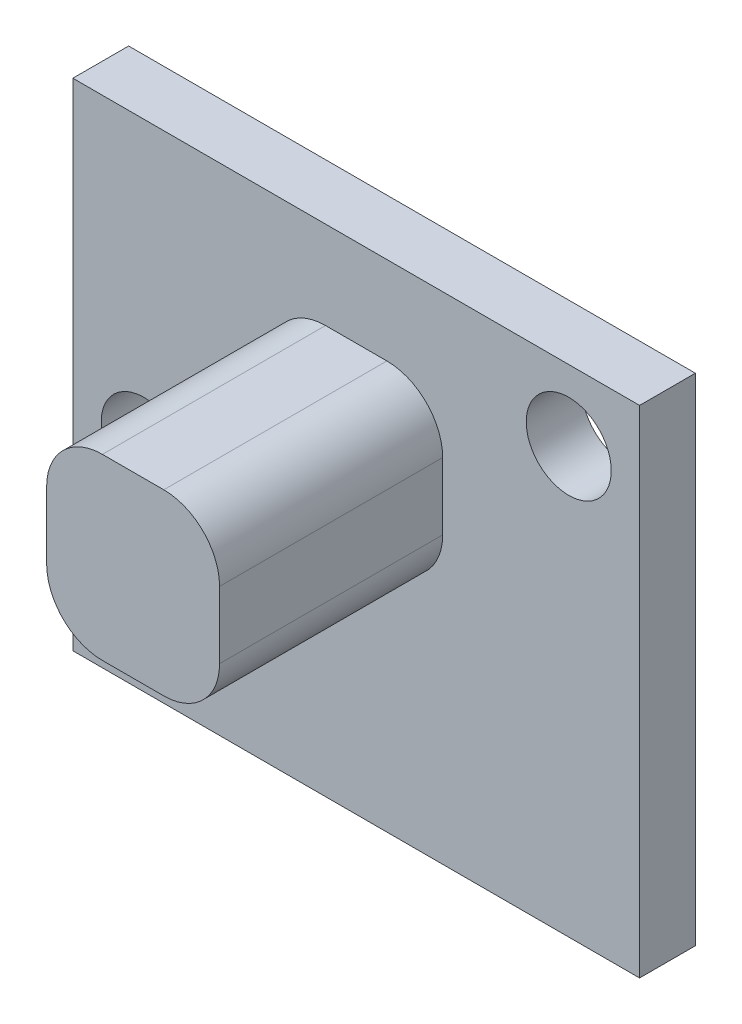
ISO-10303-21;
HEADER;
FILE_DESCRIPTION(('STEP AP214'),'2;1');
FILE_NAME('part.step','',(''),(''),'','','');
FILE_SCHEMA(('AUTOMOTIVE_DESIGN { 1 0 10303 214 1 1 1 1 }'));
ENDSEC;
DATA;
#1=APPLICATION_CONTEXT('core data for automotive mechanical design processes');
#2=APPLICATION_PROTOCOL_DEFINITION('international standard','automotive_design',2000,#1);
#3=PRODUCT_CONTEXT('',#1,'mechanical');
#4=PRODUCT('Part','Part','',(#3));
#5=PRODUCT_RELATED_PRODUCT_CATEGORY('part','',(#4));
#6=PRODUCT_DEFINITION_FORMATION('','',#4);
#7=PRODUCT_DEFINITION_CONTEXT('part definition',#1,'design');
#8=PRODUCT_DEFINITION('design','',#6,#7);
#9=PRODUCT_DEFINITION_SHAPE('','',#8);
#10=(LENGTH_UNIT() NAMED_UNIT(*) SI_UNIT(.MILLI.,.METRE.));
#11=(NAMED_UNIT(*) PLANE_ANGLE_UNIT() SI_UNIT($,.RADIAN.));
#12=(NAMED_UNIT(*) SI_UNIT($,.STERADIAN.) SOLID_ANGLE_UNIT());
#13=UNCERTAINTY_MEASURE_WITH_UNIT(LENGTH_MEASURE(1.E-05),#10,'distance_accuracy_value','');
#14=(GEOMETRIC_REPRESENTATION_CONTEXT(3) GLOBAL_UNCERTAINTY_ASSIGNED_CONTEXT((#13)) GLOBAL_UNIT_ASSIGNED_CONTEXT((#10,
#11,#12)) REPRESENTATION_CONTEXT('',''));
#15=CARTESIAN_POINT('',(0.,0.,0.));
#16=DIRECTION('',(0.,0.,1.));
#17=DIRECTION('',(1.,0.,0.));
#18=AXIS2_PLACEMENT_3D('',#15,#16,#17);
#19=CARTESIAN_POINT('',(0.,0.,2.));
#20=DIRECTION('',(0.,1.,0.));
#21=DIRECTION('',(0.,0.,1.));
#22=AXIS2_PLACEMENT_3D('',#19,#20,#21);
#23=PLANE('',#22);
#24=DIRECTION('',(1.,0.,0.));
#25=VECTOR('',#24,1.);
#26=CARTESIAN_POINT('',(0.,0.,0.));
#27=LINE('',#26,#25);
#28=CARTESIAN_POINT('',(0.,0.,0.));
#29=VERTEX_POINT('',#28);
#30=CARTESIAN_POINT('',(20.32,0.,0.));
#31=VERTEX_POINT('',#30);
#32=EDGE_CURVE('E170',#29,#31,#27,.T.);
#33=ORIENTED_EDGE('',*,*,#32,.T.);
#34=DIRECTION('',(0.,0.,-1.));
#35=VECTOR('',#34,1.);
#36=CARTESIAN_POINT('',(20.32,0.,2.));
#37=LINE('',#36,#35);
#38=CARTESIAN_POINT('',(20.32,0.,2.));
#39=VERTEX_POINT('',#38);
#40=EDGE_CURVE('E151',#39,#31,#37,.T.);
#41=ORIENTED_EDGE('',*,*,#40,.F.);
#42=DIRECTION('',(1.,0.,0.));
#43=VECTOR('',#42,1.);
#44=CARTESIAN_POINT('',(0.,0.,2.));
#45=LINE('',#44,#43);
#46=CARTESIAN_POINT('',(0.,0.,2.));
#47=VERTEX_POINT('',#46);
#48=EDGE_CURVE('E158',#47,#39,#45,.T.);
#49=ORIENTED_EDGE('',*,*,#48,.F.);
#50=DIRECTION('',(0.,0.,-1.));
#51=VECTOR('',#50,1.);
#52=CARTESIAN_POINT('',(0.,0.,2.));
#53=LINE('',#52,#51);
#54=EDGE_CURVE('E253',#47,#29,#53,.T.);
#55=ORIENTED_EDGE('',*,*,#54,.T.);
#56=EDGE_LOOP('',(#33,#41,#49,#55));
#57=FACE_BOUND('',#56,.T.);
#58=ADVANCED_FACE('F59',(#57),#23,.F.);
#59=CARTESIAN_POINT('',(20.32,0.,2.));
#60=DIRECTION('',(-1.,0.,0.));
#61=DIRECTION('',(0.,0.,1.));
#62=AXIS2_PLACEMENT_3D('',#59,#60,#61);
#63=PLANE('',#62);
#64=DIRECTION('',(0.,1.,0.));
#65=VECTOR('',#64,1.);
#66=CARTESIAN_POINT('',(20.32,0.,0.));
#67=LINE('',#66,#65);
#68=CARTESIAN_POINT('',(20.32,17.78,0.));
#69=VERTEX_POINT('',#68);
#70=EDGE_CURVE('E260',#31,#69,#67,.T.);
#71=ORIENTED_EDGE('',*,*,#70,.T.);
#72=DIRECTION('',(0.,0.,-1.));
#73=VECTOR('',#72,1.);
#74=CARTESIAN_POINT('',(20.32,17.78,2.));
#75=LINE('',#74,#73);
#76=CARTESIAN_POINT('',(20.32,17.78,2.));
#77=VERTEX_POINT('',#76);
#78=EDGE_CURVE('E154',#77,#69,#75,.T.);
#79=ORIENTED_EDGE('',*,*,#78,.F.);
#80=DIRECTION('',(0.,1.,0.));
#81=VECTOR('',#80,1.);
#82=CARTESIAN_POINT('',(20.32,0.,2.));
#83=LINE('',#82,#81);
#84=EDGE_CURVE('E147',#39,#77,#83,.T.);
#85=ORIENTED_EDGE('',*,*,#84,.F.);
#86=ORIENTED_EDGE('',*,*,#40,.T.);
#87=EDGE_LOOP('',(#71,#79,#85,#86));
#88=FACE_BOUND('',#87,.T.);
#89=ADVANCED_FACE('F149',(#88),#63,.F.);
#90=CARTESIAN_POINT('',(0.,17.78,2.));
#91=DIRECTION('',(0.,-1.,0.));
#92=DIRECTION('',(0.,0.,-1.));
#93=AXIS2_PLACEMENT_3D('',#90,#91,#92);
#94=PLANE('',#93);
#95=DIRECTION('',(-1.,0.,0.));
#96=VECTOR('',#95,1.);
#97=CARTESIAN_POINT('',(0.,17.78,0.));
#98=LINE('',#97,#96);
#99=CARTESIAN_POINT('',(0.,17.78,0.));
#100=VERTEX_POINT('',#99);
#101=EDGE_CURVE('E262',#69,#100,#98,.T.);
#102=ORIENTED_EDGE('',*,*,#101,.T.);
#103=DIRECTION('',(0.,0.,-1.));
#104=VECTOR('',#103,1.);
#105=CARTESIAN_POINT('',(0.,17.78,2.));
#106=LINE('',#105,#104);
#107=CARTESIAN_POINT('',(0.,17.78,2.));
#108=VERTEX_POINT('',#107);
#109=EDGE_CURVE('E175',#108,#100,#106,.T.);
#110=ORIENTED_EDGE('',*,*,#109,.F.);
#111=DIRECTION('',(-1.,0.,0.));
#112=VECTOR('',#111,1.);
#113=CARTESIAN_POINT('',(0.,17.78,2.));
#114=LINE('',#113,#112);
#115=EDGE_CURVE('E157',#77,#108,#114,.T.);
#116=ORIENTED_EDGE('',*,*,#115,.F.);
#117=ORIENTED_EDGE('',*,*,#78,.T.);
#118=EDGE_LOOP('',(#102,#110,#116,#117));
#119=FACE_BOUND('',#118,.T.);
#120=ADVANCED_FACE('F274',(#119),#94,.F.);
#121=CARTESIAN_POINT('',(2.54,7.62,2.));
#122=DIRECTION('',(0.,0.,-1.));
#123=DIRECTION('',(-1.,0.,0.));
#124=AXIS2_PLACEMENT_3D('',#121,#122,#123);
#125=CYLINDRICAL_SURFACE('',#124,1.524);
#126=CARTESIAN_POINT('',(2.54,7.62,2.));
#127=DIRECTION('',(0.,0.,1.));
#128=DIRECTION('',(1.,0.,0.));
#129=AXIS2_PLACEMENT_3D('',#126,#127,#128);
#130=CIRCLE('',#129,1.524);
#131=CARTESIAN_POINT('',(4.064,7.62,2.));
#132=VERTEX_POINT('',#131);
#133=EDGE_CURVE('E167',#132,#132,#130,.T.);
#134=ORIENTED_EDGE('',*,*,#133,.T.);
#135=EDGE_LOOP('',(#134));
#136=FACE_BOUND('',#135,.T.);
#137=CARTESIAN_POINT('',(2.54,7.62,0.));
#138=DIRECTION('',(0.,0.,1.));
#139=DIRECTION('',(1.,0.,0.));
#140=AXIS2_PLACEMENT_3D('',#137,#138,#139);
#141=CIRCLE('',#140,1.524);
#142=CARTESIAN_POINT('',(4.064,7.62,0.));
#143=VERTEX_POINT('',#142);
#144=EDGE_CURVE('E256',#143,#143,#141,.T.);
#145=ORIENTED_EDGE('',*,*,#144,.F.);
#146=EDGE_LOOP('',(#145));
#147=FACE_BOUND('',#146,.T.);
#148=ADVANCED_FACE('F276',(#136,#147),#125,.F.);
#149=CARTESIAN_POINT('',(17.78,15.24,2.));
#150=DIRECTION('',(0.,0.,-1.));
#151=DIRECTION('',(-1.,0.,0.));
#152=AXIS2_PLACEMENT_3D('',#149,#150,#151);
#153=CYLINDRICAL_SURFACE('',#152,1.524);
#154=CARTESIAN_POINT('',(17.78,15.24,2.));
#155=DIRECTION('',(0.,0.,1.));
#156=DIRECTION('',(1.,0.,0.));
#157=AXIS2_PLACEMENT_3D('',#154,#155,#156);
#158=CIRCLE('',#157,1.524);
#159=CARTESIAN_POINT('',(19.304,15.24,2.));
#160=VERTEX_POINT('',#159);
#161=EDGE_CURVE('E245',#160,#160,#158,.T.);
#162=ORIENTED_EDGE('',*,*,#161,.T.);
#163=EDGE_LOOP('',(#162));
#164=FACE_BOUND('',#163,.T.);
#165=CARTESIAN_POINT('',(17.78,15.24,0.));
#166=DIRECTION('',(0.,0.,1.));
#167=DIRECTION('',(1.,0.,0.));
#168=AXIS2_PLACEMENT_3D('',#165,#166,#167);
#169=CIRCLE('',#168,1.524);
#170=CARTESIAN_POINT('',(19.304,15.24,0.));
#171=VERTEX_POINT('',#170);
#172=EDGE_CURVE('E216',#171,#171,#169,.T.);
#173=ORIENTED_EDGE('',*,*,#172,.F.);
#174=EDGE_LOOP('',(#173));
#175=FACE_BOUND('',#174,.T.);
#176=ADVANCED_FACE('F282',(#164,#175),#153,.F.);
#177=CARTESIAN_POINT('',(0.,0.,2.));
#178=DIRECTION('',(1.,0.,0.));
#179=DIRECTION('',(0.,1.,0.));
#180=AXIS2_PLACEMENT_3D('',#177,#178,#179);
#181=PLANE('',#180);
#182=DIRECTION('',(0.,-1.,0.));
#183=VECTOR('',#182,1.);
#184=CARTESIAN_POINT('',(0.,0.,0.));
#185=LINE('',#184,#183);
#186=EDGE_CURVE('E248',#100,#29,#185,.T.);
#187=ORIENTED_EDGE('',*,*,#186,.T.);
#188=ORIENTED_EDGE('',*,*,#54,.F.);
#189=DIRECTION('',(0.,-1.,0.));
#190=VECTOR('',#189,1.);
#191=CARTESIAN_POINT('',(0.,0.,2.));
#192=LINE('',#191,#190);
#193=EDGE_CURVE('E163',#108,#47,#192,.T.);
#194=ORIENTED_EDGE('',*,*,#193,.F.);
#195=ORIENTED_EDGE('',*,*,#109,.T.);
#196=EDGE_LOOP('',(#187,#188,#194,#195));
#197=FACE_BOUND('',#196,.T.);
#198=ADVANCED_FACE('F269',(#197),#181,.F.);
#199=CARTESIAN_POINT('',(0.,0.,2.));
#200=DIRECTION('',(0.,0.,1.));
#201=DIRECTION('',(1.,0.,0.));
#202=AXIS2_PLACEMENT_3D('',#199,#200,#201);
#203=PLANE('',#202);
#204=DIRECTION('',(1.,0.,0.));
#205=VECTOR('',#204,1.);
#206=CARTESIAN_POINT('',(7.0600062,8.2300064,2.));
#207=LINE('',#206,#205);
#208=CARTESIAN_POINT('',(9.0600062,8.2300064,2.));
#209=VERTEX_POINT('',#208);
#210=CARTESIAN_POINT('',(11.2599938,8.2300064,2.));
#211=VERTEX_POINT('',#210);
#212=EDGE_CURVE('E209',#209,#211,#207,.T.);
#213=ORIENTED_EDGE('',*,*,#212,.F.);
#214=CARTESIAN_POINT('',(9.0600062,10.2300064,2.));
#215=DIRECTION('',(0.,0.,1.));
#216=DIRECTION('',(1.,0.,0.));
#217=AXIS2_PLACEMENT_3D('',#214,#215,#216);
#218=CIRCLE('',#217,2.);
#219=CARTESIAN_POINT('',(7.0600062,10.2300064,2.));
#220=VERTEX_POINT('',#219);
#221=EDGE_CURVE('E205',#209,#220,#218,.F.);
#222=ORIENTED_EDGE('',*,*,#221,.T.);
#223=DIRECTION('',(0.,1.,0.));
#224=VECTOR('',#223,1.);
#225=CARTESIAN_POINT('',(7.0600062,8.2300064,2.));
#226=LINE('',#225,#224);
#227=CARTESIAN_POINT('',(7.0600062,12.6299936,2.));
#228=VERTEX_POINT('',#227);
#229=EDGE_CURVE('E234',#220,#228,#226,.T.);
#230=ORIENTED_EDGE('',*,*,#229,.T.);
#231=CARTESIAN_POINT('',(9.0600062,12.6299936,2.));
#232=DIRECTION('',(0.,0.,1.));
#233=DIRECTION('',(1.,0.,0.));
#234=AXIS2_PLACEMENT_3D('',#231,#232,#233);
#235=CIRCLE('',#234,2.);
#236=CARTESIAN_POINT('',(9.0600062,14.6299936,2.));
#237=VERTEX_POINT('',#236);
#238=EDGE_CURVE('E203',#228,#237,#235,.F.);
#239=ORIENTED_EDGE('',*,*,#238,.T.);
#240=DIRECTION('',(1.,0.,0.));
#241=VECTOR('',#240,1.);
#242=CARTESIAN_POINT('',(7.0600062,14.6299936,2.));
#243=LINE('',#242,#241);
#244=CARTESIAN_POINT('',(11.2599938,14.6299936,2.));
#245=VERTEX_POINT('',#244);
#246=EDGE_CURVE('E242',#237,#245,#243,.T.);
#247=ORIENTED_EDGE('',*,*,#246,.T.);
#248=CARTESIAN_POINT('',(11.2599938,12.6299936,2.));
#249=DIRECTION('',(0.,0.,1.));
#250=DIRECTION('',(1.,0.,0.));
#251=AXIS2_PLACEMENT_3D('',#248,#249,#250);
#252=CIRCLE('',#251,2.);
#253=CARTESIAN_POINT('',(13.2599938,12.6299936,2.));
#254=VERTEX_POINT('',#253);
#255=EDGE_CURVE('E12',#245,#254,#252,.F.);
#256=ORIENTED_EDGE('',*,*,#255,.T.);
#257=DIRECTION('',(0.,-1.,0.));
#258=VECTOR('',#257,1.);
#259=CARTESIAN_POINT('',(13.2599938,14.6299936,2.));
#260=LINE('',#259,#258);
#261=CARTESIAN_POINT('',(13.2599938,10.2300064,2.));
#262=VERTEX_POINT('',#261);
#263=EDGE_CURVE('E210',#254,#262,#260,.T.);
#264=ORIENTED_EDGE('',*,*,#263,.T.);
#265=CARTESIAN_POINT('',(11.2599938,10.2300064,2.));
#266=DIRECTION('',(0.,0.,1.));
#267=DIRECTION('',(1.,0.,0.));
#268=AXIS2_PLACEMENT_3D('',#265,#266,#267);
#269=CIRCLE('',#268,2.);
#270=EDGE_CURVE('E67',#262,#211,#269,.F.);
#271=ORIENTED_EDGE('',*,*,#270,.T.);
#272=EDGE_LOOP('',(#213,#222,#230,#239,#247,#256,#264,#271));
#273=FACE_BOUND('',#272,.T.);
#274=ORIENTED_EDGE('',*,*,#161,.F.);
#275=EDGE_LOOP('',(#274));
#276=FACE_BOUND('',#275,.T.);
#277=ORIENTED_EDGE('',*,*,#133,.F.);
#278=EDGE_LOOP('',(#277));
#279=FACE_BOUND('',#278,.T.);
#280=ORIENTED_EDGE('',*,*,#48,.T.);
#281=ORIENTED_EDGE('',*,*,#84,.T.);
#282=ORIENTED_EDGE('',*,*,#115,.T.);
#283=ORIENTED_EDGE('',*,*,#193,.T.);
#284=EDGE_LOOP('',(#280,#281,#282,#283));
#285=FACE_BOUND('',#284,.T.);
#286=ADVANCED_FACE('F161',(#273,#276,#279,#285),#203,.T.);
#287=CARTESIAN_POINT('',(0.,0.,0.));
#288=DIRECTION('',(0.,0.,1.));
#289=DIRECTION('',(1.,0.,0.));
#290=AXIS2_PLACEMENT_3D('',#287,#288,#289);
#291=PLANE('',#290);
#292=ORIENTED_EDGE('',*,*,#172,.T.);
#293=EDGE_LOOP('',(#292));
#294=FACE_BOUND('',#293,.T.);
#295=ORIENTED_EDGE('',*,*,#144,.T.);
#296=EDGE_LOOP('',(#295));
#297=FACE_BOUND('',#296,.T.);
#298=ORIENTED_EDGE('',*,*,#32,.F.);
#299=ORIENTED_EDGE('',*,*,#186,.F.);
#300=ORIENTED_EDGE('',*,*,#101,.F.);
#301=ORIENTED_EDGE('',*,*,#70,.F.);
#302=EDGE_LOOP('',(#298,#299,#300,#301));
#303=FACE_BOUND('',#302,.T.);
#304=ADVANCED_FACE('F273',(#294,#297,#303),#291,.F.);
#305=CARTESIAN_POINT('',(7.0600062,0.,10.));
#306=DIRECTION('',(-1.,0.,0.));
#307=DIRECTION('',(0.,0.,1.));
#308=AXIS2_PLACEMENT_3D('',#305,#306,#307);
#309=PLANE('',#308);
#310=DIRECTION('',(0.,1.,0.));
#311=VECTOR('',#310,1.);
#312=CARTESIAN_POINT('',(7.0600062,0.,10.));
#313=LINE('',#312,#311);
#314=CARTESIAN_POINT('',(7.0600062,10.2300064,10.));
#315=VERTEX_POINT('',#314);
#316=CARTESIAN_POINT('',(7.0600062,12.6299936,10.));
#317=VERTEX_POINT('',#316);
#318=EDGE_CURVE('E236',#315,#317,#313,.T.);
#319=ORIENTED_EDGE('',*,*,#318,.T.);
#320=DIRECTION('',(0.,0.,-1.));
#321=VECTOR('',#320,1.);
#322=CARTESIAN_POINT('',(7.0600062,12.6299936,10.));
#323=LINE('',#322,#321);
#324=EDGE_CURVE('E173',#317,#228,#323,.T.);
#325=ORIENTED_EDGE('',*,*,#324,.T.);
#326=ORIENTED_EDGE('',*,*,#229,.F.);
#327=DIRECTION('',(0.,0.,-1.));
#328=VECTOR('',#327,1.);
#329=CARTESIAN_POINT('',(7.0600062,10.2300064,10.));
#330=LINE('',#329,#328);
#331=EDGE_CURVE('E171',#220,#315,#330,.F.);
#332=ORIENTED_EDGE('',*,*,#331,.T.);
#333=EDGE_LOOP('',(#319,#325,#326,#332));
#334=FACE_BOUND('',#333,.T.);
#335=ADVANCED_FACE('F320',(#334),#309,.T.);
#336=CARTESIAN_POINT('',(0.,8.2300064,10.));
#337=DIRECTION('',(0.,1.,0.));
#338=DIRECTION('',(0.,0.,1.));
#339=AXIS2_PLACEMENT_3D('',#336,#337,#338);
#340=PLANE('',#339);
#341=DIRECTION('',(1.,0.,0.));
#342=VECTOR('',#341,1.);
#343=CARTESIAN_POINT('',(0.,8.2300064,10.));
#344=LINE('',#343,#342);
#345=CARTESIAN_POINT('',(9.0600062,8.2300064,10.));
#346=VERTEX_POINT('',#345);
#347=CARTESIAN_POINT('',(11.2599938,8.2300064,10.));
#348=VERTEX_POINT('',#347);
#349=EDGE_CURVE('E227',#346,#348,#344,.T.);
#350=ORIENTED_EDGE('',*,*,#349,.F.);
#351=DIRECTION('',(0.,0.,-1.));
#352=VECTOR('',#351,1.);
#353=CARTESIAN_POINT('',(9.0600062,8.2300064,2.));
#354=LINE('',#353,#352);
#355=EDGE_CURVE('E196',#346,#209,#354,.T.);
#356=ORIENTED_EDGE('',*,*,#355,.T.);
#357=ORIENTED_EDGE('',*,*,#212,.T.);
#358=DIRECTION('',(0.,0.,-1.));
#359=VECTOR('',#358,1.);
#360=CARTESIAN_POINT('',(11.2599938,8.2300064,10.));
#361=LINE('',#360,#359);
#362=EDGE_CURVE('E194',#211,#348,#361,.F.);
#363=ORIENTED_EDGE('',*,*,#362,.T.);
#364=EDGE_LOOP('',(#350,#356,#357,#363));
#365=FACE_BOUND('',#364,.T.);
#366=ADVANCED_FACE('F213',(#365),#340,.F.);
#367=CARTESIAN_POINT('',(13.2599938,0.,10.));
#368=DIRECTION('',(1.,0.,0.));
#369=DIRECTION('',(0.,0.,-1.));
#370=AXIS2_PLACEMENT_3D('',#367,#368,#369);
#371=PLANE('',#370);
#372=DIRECTION('',(0.,-1.,0.));
#373=VECTOR('',#372,1.);
#374=CARTESIAN_POINT('',(13.2599938,0.,10.));
#375=LINE('',#374,#373);
#376=CARTESIAN_POINT('',(13.2599938,12.6299936,10.));
#377=VERTEX_POINT('',#376);
#378=CARTESIAN_POINT('',(13.2599938,10.2300064,10.));
#379=VERTEX_POINT('',#378);
#380=EDGE_CURVE('E225',#377,#379,#375,.T.);
#381=ORIENTED_EDGE('',*,*,#380,.T.);
#382=DIRECTION('',(0.,0.,-1.));
#383=VECTOR('',#382,1.);
#384=CARTESIAN_POINT('',(13.2599938,10.2300064,2.));
#385=LINE('',#384,#383);
#386=EDGE_CURVE('E201',#379,#262,#385,.T.);
#387=ORIENTED_EDGE('',*,*,#386,.T.);
#388=ORIENTED_EDGE('',*,*,#263,.F.);
#389=DIRECTION('',(0.,0.,-1.));
#390=VECTOR('',#389,1.);
#391=CARTESIAN_POINT('',(13.2599938,12.6299936,10.));
#392=LINE('',#391,#390);
#393=EDGE_CURVE('E199',#254,#377,#392,.F.);
#394=ORIENTED_EDGE('',*,*,#393,.T.);
#395=EDGE_LOOP('',(#381,#387,#388,#394));
#396=FACE_BOUND('',#395,.T.);
#397=ADVANCED_FACE('F229',(#396),#371,.T.);
#398=CARTESIAN_POINT('',(0.,14.6299936,10.));
#399=DIRECTION('',(0.,1.,0.));
#400=DIRECTION('',(0.,0.,1.));
#401=AXIS2_PLACEMENT_3D('',#398,#399,#400);
#402=PLANE('',#401);
#403=ORIENTED_EDGE('',*,*,#246,.F.);
#404=DIRECTION('',(0.,0.,-1.));
#405=VECTOR('',#404,1.);
#406=CARTESIAN_POINT('',(9.0600062,14.6299936,10.));
#407=LINE('',#406,#405);
#408=CARTESIAN_POINT('',(9.0600062,14.6299936,10.));
#409=VERTEX_POINT('',#408);
#410=EDGE_CURVE('E184',#237,#409,#407,.F.);
#411=ORIENTED_EDGE('',*,*,#410,.T.);
#412=DIRECTION('',(1.,0.,0.));
#413=VECTOR('',#412,1.);
#414=CARTESIAN_POINT('',(0.,14.6299936,10.));
#415=LINE('',#414,#413);
#416=CARTESIAN_POINT('',(11.2599938,14.6299936,10.));
#417=VERTEX_POINT('',#416);
#418=EDGE_CURVE('E231',#409,#417,#415,.T.);
#419=ORIENTED_EDGE('',*,*,#418,.T.);
#420=DIRECTION('',(0.,0.,-1.));
#421=VECTOR('',#420,1.);
#422=CARTESIAN_POINT('',(11.2599938,14.6299936,10.));
#423=LINE('',#422,#421);
#424=EDGE_CURVE('E181',#417,#245,#423,.T.);
#425=ORIENTED_EDGE('',*,*,#424,.T.);
#426=EDGE_LOOP('',(#403,#411,#419,#425));
#427=FACE_BOUND('',#426,.T.);
#428=ADVANCED_FACE('F313',(#427),#402,.T.);
#429=CARTESIAN_POINT('',(0.,0.,10.));
#430=DIRECTION('',(0.,0.,1.));
#431=DIRECTION('',(1.,0.,0.));
#432=AXIS2_PLACEMENT_3D('',#429,#430,#431);
#433=PLANE('',#432);
#434=ORIENTED_EDGE('',*,*,#418,.F.);
#435=CARTESIAN_POINT('',(9.0600062,12.6299936,10.));
#436=DIRECTION('',(0.,0.,1.));
#437=DIRECTION('',(1.,0.,0.));
#438=AXIS2_PLACEMENT_3D('',#435,#436,#437);
#439=CIRCLE('',#438,2.);
#440=EDGE_CURVE('E192',#409,#317,#439,.T.);
#441=ORIENTED_EDGE('',*,*,#440,.T.);
#442=ORIENTED_EDGE('',*,*,#318,.F.);
#443=CARTESIAN_POINT('',(9.0600062,10.2300064,10.));
#444=DIRECTION('',(0.,0.,1.));
#445=DIRECTION('',(1.,0.,0.));
#446=AXIS2_PLACEMENT_3D('',#443,#444,#445);
#447=CIRCLE('',#446,2.);
#448=EDGE_CURVE('E190',#315,#346,#447,.T.);
#449=ORIENTED_EDGE('',*,*,#448,.T.);
#450=ORIENTED_EDGE('',*,*,#349,.T.);
#451=CARTESIAN_POINT('',(11.2599938,10.2300064,10.));
#452=DIRECTION('',(0.,0.,1.));
#453=DIRECTION('',(1.,0.,0.));
#454=AXIS2_PLACEMENT_3D('',#451,#452,#453);
#455=CIRCLE('',#454,2.);
#456=EDGE_CURVE('E188',#348,#379,#455,.T.);
#457=ORIENTED_EDGE('',*,*,#456,.T.);
#458=ORIENTED_EDGE('',*,*,#380,.F.);
#459=CARTESIAN_POINT('',(11.2599938,12.6299936,10.));
#460=DIRECTION('',(0.,0.,1.));
#461=DIRECTION('',(1.,0.,0.));
#462=AXIS2_PLACEMENT_3D('',#459,#460,#461);
#463=CIRCLE('',#462,2.);
#464=EDGE_CURVE('E186',#377,#417,#463,.T.);
#465=ORIENTED_EDGE('',*,*,#464,.T.);
#466=EDGE_LOOP('',(#434,#441,#442,#449,#450,#457,#458,#465));
#467=FACE_BOUND('',#466,.T.);
#468=ADVANCED_FACE('F224',(#467),#433,.T.);
#469=CARTESIAN_POINT('',(9.0600062,12.6299936,10.));
#470=DIRECTION('',(0.,0.,-1.));
#471=DIRECTION('',(-1.,0.,0.));
#472=AXIS2_PLACEMENT_3D('',#469,#470,#471);
#473=CYLINDRICAL_SURFACE('',#472,2.);
#474=ORIENTED_EDGE('',*,*,#440,.F.);
#475=ORIENTED_EDGE('',*,*,#410,.F.);
#476=ORIENTED_EDGE('',*,*,#238,.F.);
#477=ORIENTED_EDGE('',*,*,#324,.F.);
#478=EDGE_LOOP('',(#474,#475,#476,#477));
#479=FACE_BOUND('',#478,.T.);
#480=ADVANCED_FACE('F295',(#479),#473,.T.);
#481=CARTESIAN_POINT('',(9.0600062,10.2300064,10.));
#482=DIRECTION('',(0.,0.,1.));
#483=DIRECTION('',(1.,0.,0.));
#484=AXIS2_PLACEMENT_3D('',#481,#482,#483);
#485=CYLINDRICAL_SURFACE('',#484,2.);
#486=ORIENTED_EDGE('',*,*,#448,.F.);
#487=ORIENTED_EDGE('',*,*,#331,.F.);
#488=ORIENTED_EDGE('',*,*,#221,.F.);
#489=ORIENTED_EDGE('',*,*,#355,.F.);
#490=EDGE_LOOP('',(#486,#487,#488,#489));
#491=FACE_BOUND('',#490,.T.);
#492=ADVANCED_FACE('F298',(#491),#485,.T.);
#493=CARTESIAN_POINT('',(11.2599938,10.2300064,10.));
#494=DIRECTION('',(0.,0.,1.));
#495=DIRECTION('',(1.,0.,0.));
#496=AXIS2_PLACEMENT_3D('',#493,#494,#495);
#497=CYLINDRICAL_SURFACE('',#496,2.);
#498=ORIENTED_EDGE('',*,*,#456,.F.);
#499=ORIENTED_EDGE('',*,*,#362,.F.);
#500=ORIENTED_EDGE('',*,*,#270,.F.);
#501=ORIENTED_EDGE('',*,*,#386,.F.);
#502=EDGE_LOOP('',(#498,#499,#500,#501));
#503=FACE_BOUND('',#502,.T.);
#504=ADVANCED_FACE('F219',(#503),#497,.T.);
#505=CARTESIAN_POINT('',(11.2599938,12.6299936,10.));
#506=DIRECTION('',(0.,0.,-1.));
#507=DIRECTION('',(-1.,0.,0.));
#508=AXIS2_PLACEMENT_3D('',#505,#506,#507);
#509=CYLINDRICAL_SURFACE('',#508,2.);
#510=ORIENTED_EDGE('',*,*,#464,.F.);
#511=ORIENTED_EDGE('',*,*,#393,.F.);
#512=ORIENTED_EDGE('',*,*,#255,.F.);
#513=ORIENTED_EDGE('',*,*,#424,.F.);
#514=EDGE_LOOP('',(#510,#511,#512,#513));
#515=FACE_BOUND('',#514,.T.);
#516=ADVANCED_FACE('F61',(#515),#509,.T.);
#517=CLOSED_SHELL('',(#58,#89,#120,#148,#176,#198,#286,#304,#335,#366,#397,#428,#468,#480,#492,
#504,#516));
#518=MANIFOLD_SOLID_BREP('B2',#517);
#519=ADVANCED_BREP_SHAPE_REPRESENTATION('',(#18,#518),#14);
#520=SHAPE_DEFINITION_REPRESENTATION(#9,#519);
ENDSEC;
END-ISO-10303-21;
